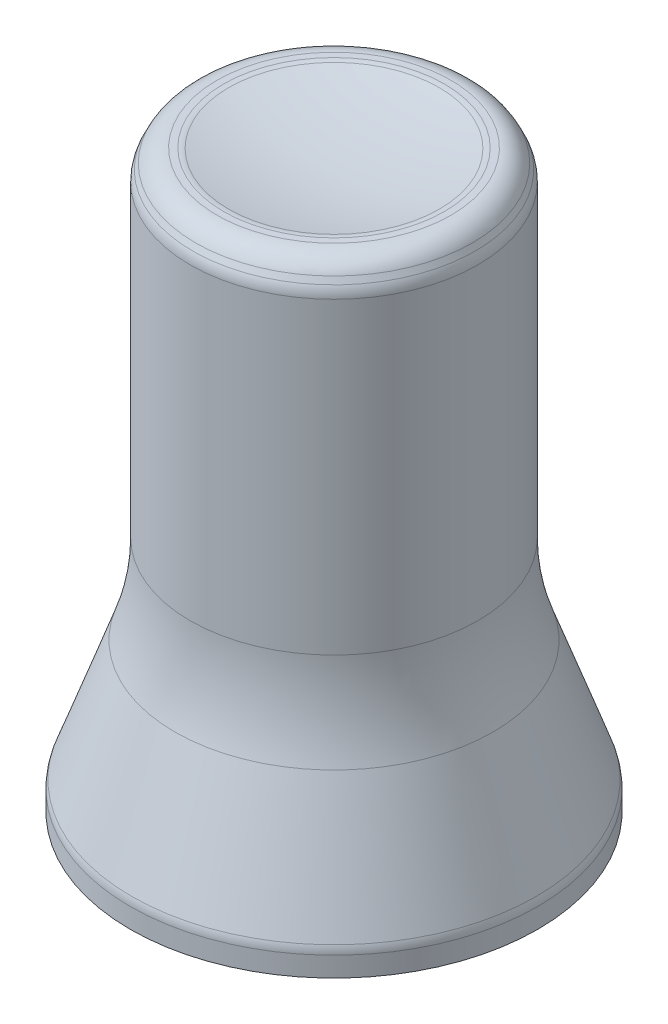
ISO-10303-21;
HEADER;
FILE_DESCRIPTION(('STEP AP214'),'2;1');
FILE_NAME('part.step','',(''),(''),'','','');
FILE_SCHEMA(('AUTOMOTIVE_DESIGN { 1 0 10303 214 1 1 1 1 }'));
ENDSEC;
DATA;
#1=APPLICATION_CONTEXT('core data for automotive mechanical design processes');
#2=APPLICATION_PROTOCOL_DEFINITION('international standard','automotive_design',2000,#1);
#3=PRODUCT_CONTEXT('',#1,'mechanical');
#4=PRODUCT('Part','Part','',(#3));
#5=PRODUCT_RELATED_PRODUCT_CATEGORY('part','',(#4));
#6=PRODUCT_DEFINITION_FORMATION('','',#4);
#7=PRODUCT_DEFINITION_CONTEXT('part definition',#1,'design');
#8=PRODUCT_DEFINITION('design','',#6,#7);
#9=PRODUCT_DEFINITION_SHAPE('','',#8);
#10=(LENGTH_UNIT() NAMED_UNIT(*) SI_UNIT(.MILLI.,.METRE.));
#11=(NAMED_UNIT(*) PLANE_ANGLE_UNIT() SI_UNIT($,.RADIAN.));
#12=(NAMED_UNIT(*) SI_UNIT($,.STERADIAN.) SOLID_ANGLE_UNIT());
#13=UNCERTAINTY_MEASURE_WITH_UNIT(LENGTH_MEASURE(1.E-05),#10,'distance_accuracy_value','');
#14=(GEOMETRIC_REPRESENTATION_CONTEXT(3) GLOBAL_UNCERTAINTY_ASSIGNED_CONTEXT((#13)) GLOBAL_UNIT_ASSIGNED_CONTEXT((#10,
#11,#12)) REPRESENTATION_CONTEXT('',''));
#15=CARTESIAN_POINT('',(0.,0.,0.));
#16=DIRECTION('',(0.,0.,1.));
#17=DIRECTION('',(1.,0.,0.));
#18=AXIS2_PLACEMENT_3D('',#15,#16,#17);
#19=CARTESIAN_POINT('',(0.,17.75,0.));
#20=DIRECTION('',(0.,1.,0.));
#21=DIRECTION('',(-1.,0.,0.));
#22=AXIS2_PLACEMENT_3D('',#19,#20,#21);
#23=CYLINDRICAL_SURFACE('',#22,3.05);
#24=CARTESIAN_POINT('',(0.,7.325,0.));
#25=DIRECTION('',(0.,1.,0.));
#26=DIRECTION('',(-1.,0.,0.));
#27=AXIS2_PLACEMENT_3D('',#24,#25,#26);
#28=CIRCLE('',#27,3.05);
#29=CARTESIAN_POINT('',(2.42487113059643,7.325,1.85));
#30=VERTEX_POINT('',#29);
#31=CARTESIAN_POINT('',(0.0999865618490292,7.325,-3.04836065573771));
#32=VERTEX_POINT('',#31);
#33=EDGE_CURVE('E105',#30,#32,#28,.T.);
#34=ORIENTED_EDGE('',*,*,#33,.F.);
#35=CARTESIAN_POINT('',(0.,9.175,0.));
#36=DIRECTION('',(0.,0.707106781186547,0.707106781186547));
#37=DIRECTION('',(0.,0.707106781186548,-0.707106781186548));
#38=AXIS2_PLACEMENT_3D('',#35,#36,#37);
#39=ELLIPSE('',#38,4.31335136523794,3.05);
#40=CARTESIAN_POINT('',(2.6556543449779,7.675,1.5));
#41=VERTEX_POINT('',#40);
#42=EDGE_CURVE('E11',#30,#41,#39,.T.);
#43=ORIENTED_EDGE('',*,*,#42,.T.);
#44=DIRECTION('',(0.,1.,0.));
#45=VECTOR('',#44,1.);
#46=CARTESIAN_POINT('',(2.6556543449779,1.79214359485084,1.5));
#47=LINE('',#46,#45);
#48=CARTESIAN_POINT('',(2.6556543449779,17.75,1.5));
#49=VERTEX_POINT('',#48);
#50=EDGE_CURVE('E79',#41,#49,#47,.T.);
#51=ORIENTED_EDGE('',*,*,#50,.T.);
#52=CARTESIAN_POINT('',(0.,17.75,0.));
#53=DIRECTION('',(0.,1.,0.));
#54=DIRECTION('',(-1.,0.,0.));
#55=AXIS2_PLACEMENT_3D('',#52,#53,#54);
#56=CIRCLE('',#55,3.05);
#57=CARTESIAN_POINT('',(0.0999865618490328,17.75,-3.04836065573771));
#58=VERTEX_POINT('',#57);
#59=EDGE_CURVE('E83',#49,#58,#56,.T.);
#60=ORIENTED_EDGE('',*,*,#59,.T.);
#61=DIRECTION('',(0.,1.,0.));
#62=VECTOR('',#61,1.);
#63=CARTESIAN_POINT('',(0.0999865618490293,1.79214359485084,-3.04836065573771));
#64=LINE('',#63,#62);
#65=EDGE_CURVE('E255',#32,#58,#64,.T.);
#66=ORIENTED_EDGE('',*,*,#65,.F.);
#67=EDGE_LOOP('',(#34,#43,#51,#60,#66));
#68=FACE_BOUND('',#67,.T.);
#69=ADVANCED_FACE('F33',(#68),#23,.F.);
#70=CARTESIAN_POINT('',(-0.0999865618490304,17.75,-3.04836065573771));
#71=VERTEX_POINT('',#70);
#72=CARTESIAN_POINT('',(-2.6556543449779,17.75,1.5));
#73=VERTEX_POINT('',#72);
#74=EDGE_CURVE('E102',#71,#73,#56,.T.);
#75=ORIENTED_EDGE('',*,*,#74,.T.);
#76=DIRECTION('',(0.,1.,0.));
#77=VECTOR('',#76,1.);
#78=CARTESIAN_POINT('',(-2.6556543449779,1.79214359485084,1.5));
#79=LINE('',#78,#77);
#80=CARTESIAN_POINT('',(-2.6556543449779,7.675,1.5));
#81=VERTEX_POINT('',#80);
#82=EDGE_CURVE('E89',#81,#73,#79,.T.);
#83=ORIENTED_EDGE('',*,*,#82,.F.);
#84=CARTESIAN_POINT('',(0.,9.175,0.));
#85=DIRECTION('',(0.,0.707106781186547,0.707106781186547));
#86=DIRECTION('',(0.,0.707106781186548,-0.707106781186548));
#87=AXIS2_PLACEMENT_3D('',#84,#85,#86);
#88=ELLIPSE('',#87,4.31335136523794,3.05);
#89=CARTESIAN_POINT('',(-2.42487113059643,7.325,1.85));
#90=VERTEX_POINT('',#89);
#91=EDGE_CURVE('E42',#81,#90,#88,.T.);
#92=ORIENTED_EDGE('',*,*,#91,.T.);
#93=CARTESIAN_POINT('',(-0.0999865618490304,7.325,-3.04836065573771));
#94=VERTEX_POINT('',#93);
#95=EDGE_CURVE('E48',#94,#90,#28,.T.);
#96=ORIENTED_EDGE('',*,*,#95,.F.);
#97=DIRECTION('',(0.,1.,0.));
#98=VECTOR('',#97,1.);
#99=CARTESIAN_POINT('',(-0.0999865618490304,1.79214359485084,-3.04836065573771));
#100=LINE('',#99,#98);
#101=EDGE_CURVE('E107',#94,#71,#100,.T.);
#102=ORIENTED_EDGE('',*,*,#101,.T.);
#103=EDGE_LOOP('',(#75,#83,#92,#96,#102));
#104=FACE_BOUND('',#103,.T.);
#105=ADVANCED_FACE('F187',(#104),#23,.F.);
#106=CARTESIAN_POINT('',(3.05,17.75,0.));
#107=DIRECTION('',(0.,-1.,0.));
#108=DIRECTION('',(1.,0.,0.));
#109=AXIS2_PLACEMENT_3D('',#106,#107,#108);
#110=PLANE('',#109);
#111=ORIENTED_EDGE('',*,*,#59,.F.);
#112=DIRECTION('',(1.,0.,0.));
#113=VECTOR('',#112,1.);
#114=CARTESIAN_POINT('',(-2.6556543449779,17.75,1.5));
#115=LINE('',#114,#113);
#116=EDGE_CURVE('E90',#73,#49,#115,.T.);
#117=ORIENTED_EDGE('',*,*,#116,.F.);
#118=ORIENTED_EDGE('',*,*,#74,.F.);
#119=CARTESIAN_POINT('',(0.,17.75,-3.05));
#120=DIRECTION('',(0.,-1.,0.));
#121=DIRECTION('',(1.,0.,0.));
#122=AXIS2_PLACEMENT_3D('',#119,#120,#121);
#123=CIRCLE('',#122,0.0999999999999998);
#124=EDGE_CURVE('E101',#58,#71,#123,.T.);
#125=ORIENTED_EDGE('',*,*,#124,.F.);
#126=EDGE_LOOP('',(#111,#117,#118,#125));
#127=FACE_BOUND('',#126,.T.);
#128=ADVANCED_FACE('F100',(#127),#110,.T.);
#129=CARTESIAN_POINT('',(0.,0.,0.));
#130=DIRECTION('',(0.,1.,0.));
#131=DIRECTION('',(-1.,0.,0.));
#132=AXIS2_PLACEMENT_3D('',#129,#130,#131);
#133=PLANE('',#132);
#134=CARTESIAN_POINT('',(0.,0.,0.));
#135=DIRECTION('',(0.,1.,0.));
#136=DIRECTION('',(-1.,0.,0.));
#137=AXIS2_PLACEMENT_3D('',#134,#135,#136);
#138=CIRCLE('',#137,3.875);
#139=CARTESIAN_POINT('',(-3.875,0.,0.));
#140=VERTEX_POINT('',#139);
#141=EDGE_CURVE('E117',#140,#140,#138,.T.);
#142=ORIENTED_EDGE('',*,*,#141,.T.);
#143=EDGE_LOOP('',(#142));
#144=FACE_BOUND('',#143,.T.);
#145=CARTESIAN_POINT('',(0.,0.,0.));
#146=DIRECTION('',(0.,1.,0.));
#147=DIRECTION('',(-1.,0.,0.));
#148=AXIS2_PLACEMENT_3D('',#145,#146,#147);
#149=CIRCLE('',#148,8.5);
#150=CARTESIAN_POINT('',(-8.5,0.,0.));
#151=VERTEX_POINT('',#150);
#152=EDGE_CURVE('E120',#151,#151,#149,.T.);
#153=ORIENTED_EDGE('',*,*,#152,.F.);
#154=EDGE_LOOP('',(#153));
#155=FACE_BOUND('',#154,.T.);
#156=ADVANCED_FACE('F157',(#144,#155),#133,.F.);
#157=CARTESIAN_POINT('',(0.,23.5,0.));
#158=DIRECTION('',(0.,1.,0.));
#159=DIRECTION('',(-1.,0.,0.));
#160=AXIS2_PLACEMENT_3D('',#157,#158,#159);
#161=CYLINDRICAL_SURFACE('',#160,8.5);
#162=CARTESIAN_POINT('',(0.,0.8267862505363,0.));
#163=DIRECTION('',(0.,-1.,0.));
#164=DIRECTION('',(1.,0.,0.));
#165=AXIS2_PLACEMENT_3D('',#162,#163,#164);
#166=CIRCLE('',#165,8.5);
#167=CARTESIAN_POINT('',(8.5,0.8267862505363,0.));
#168=VERTEX_POINT('',#167);
#169=EDGE_CURVE('E222',#168,#168,#166,.T.);
#170=ORIENTED_EDGE('',*,*,#169,.T.);
#171=EDGE_LOOP('',(#170));
#172=FACE_BOUND('',#171,.T.);
#173=ORIENTED_EDGE('',*,*,#152,.T.);
#174=EDGE_LOOP('',(#173));
#175=FACE_BOUND('',#174,.T.);
#176=ADVANCED_FACE('F153',(#172,#175),#161,.T.);
#177=CARTESIAN_POINT('',(0.,1.,0.));
#178=DIRECTION('',(0.,-1.,0.));
#179=DIRECTION('',(1.,0.,0.));
#180=AXIS2_PLACEMENT_3D('',#177,#178,#179);
#181=CONICAL_SURFACE('',#180,8.5,0.343023940420703);
#182=CARTESIAN_POINT('',(0.,1.16312264753446,0.));
#183=DIRECTION('',(0.,1.,0.));
#184=DIRECTION('',(-1.,0.,0.));
#185=AXIS2_PLACEMENT_3D('',#182,#183,#184);
#186=CIRCLE('',#185,8.44174191159484);
#187=CARTESIAN_POINT('',(-8.44174191159484,1.16312264753446,0.));
#188=VERTEX_POINT('',#187);
#189=EDGE_CURVE('E217',#188,#188,#186,.T.);
#190=ORIENTED_EDGE('',*,*,#189,.T.);
#191=EDGE_LOOP('',(#190));
#192=FACE_BOUND('',#191,.T.);
#193=CARTESIAN_POINT('',(0.,6.205650877121,0.));
#194=DIRECTION('',(0.,-1.,0.));
#195=DIRECTION('',(1.,0.,0.));
#196=AXIS2_PLACEMENT_3D('',#193,#194,#195);
#197=CIRCLE('',#196,6.64083897245679);
#198=CARTESIAN_POINT('',(6.64083897245679,6.205650877121,0.));
#199=VERTEX_POINT('',#198);
#200=EDGE_CURVE('E213',#199,#199,#197,.T.);
#201=ORIENTED_EDGE('',*,*,#200,.T.);
#202=EDGE_LOOP('',(#201));
#203=FACE_BOUND('',#202,.T.);
#204=ADVANCED_FACE('F149',(#192,#203),#181,.T.);
#205=CARTESIAN_POINT('',(0.,23.5,0.));
#206=DIRECTION('',(0.,1.,0.));
#207=DIRECTION('',(-1.,0.,0.));
#208=AXIS2_PLACEMENT_3D('',#205,#206,#207);
#209=CYLINDRICAL_SURFACE('',#208,6.);
#210=CARTESIAN_POINT('',(0.,22.7639320225002,0.));
#211=DIRECTION('',(0.,-1.,0.));
#212=DIRECTION('',(1.,0.,0.));
#213=AXIS2_PLACEMENT_3D('',#210,#211,#212);
#214=CIRCLE('',#213,6.);
#215=CARTESIAN_POINT('',(6.,22.7639320225002,0.));
#216=VERTEX_POINT('',#215);
#217=EDGE_CURVE('E240',#216,#216,#214,.T.);
#218=ORIENTED_EDGE('',*,*,#217,.T.);
#219=EDGE_LOOP('',(#218));
#220=FACE_BOUND('',#219,.T.);
#221=CARTESIAN_POINT('',(0.,9.90535124410072,0.));
#222=DIRECTION('',(0.,1.,0.));
#223=DIRECTION('',(-1.,0.,0.));
#224=AXIS2_PLACEMENT_3D('',#221,#222,#223);
#225=CIRCLE('',#224,6.);
#226=CARTESIAN_POINT('',(-6.,9.90535124410072,0.));
#227=VERTEX_POINT('',#226);
#228=EDGE_CURVE('E211',#227,#227,#225,.T.);
#229=ORIENTED_EDGE('',*,*,#228,.T.);
#230=EDGE_LOOP('',(#229));
#231=FACE_BOUND('',#230,.T.);
#232=ADVANCED_FACE('F145',(#220,#231),#209,.T.);
#233=CARTESIAN_POINT('',(0.,23.,0.));
#234=DIRECTION('',(0.,-1.,0.));
#235=DIRECTION('',(1.,0.,0.));
#236=AXIS2_PLACEMENT_3D('',#233,#234,#235);
#237=CONICAL_SURFACE('',#236,6.,0.463647609000806);
#238=CARTESIAN_POINT('',(0.,23.4472135955,0.));
#239=DIRECTION('',(0.,1.,0.));
#240=DIRECTION('',(-1.,0.,0.));
#241=AXIS2_PLACEMENT_3D('',#238,#239,#240);
#242=CIRCLE('',#241,5.77639320225002);
#243=CARTESIAN_POINT('',(-5.77639320225002,23.4472135955,0.));
#244=VERTEX_POINT('',#243);
#245=EDGE_CURVE('E237',#244,#244,#242,.F.);
#246=ORIENTED_EDGE('',*,*,#245,.T.);
#247=EDGE_LOOP('',(#246));
#248=FACE_BOUND('',#247,.T.);
#249=CARTESIAN_POINT('',(0.,23.2111456180002,0.));
#250=DIRECTION('',(0.,1.,0.));
#251=DIRECTION('',(-1.,0.,0.));
#252=AXIS2_PLACEMENT_3D('',#249,#250,#251);
#253=CIRCLE('',#252,5.89442719099992);
#254=CARTESIAN_POINT('',(-5.89442719099992,23.2111456180002,0.));
#255=VERTEX_POINT('',#254);
#256=EDGE_CURVE('E234',#255,#255,#253,.T.);
#257=ORIENTED_EDGE('',*,*,#256,.T.);
#258=EDGE_LOOP('',(#257));
#259=FACE_BOUND('',#258,.T.);
#260=ADVANCED_FACE('F141',(#248,#259),#237,.T.);
#261=CARTESIAN_POINT('',(5.5,24.,0.));
#262=DIRECTION('',(0.,-1.,0.));
#263=DIRECTION('',(1.,0.,0.));
#264=AXIS2_PLACEMENT_3D('',#261,#262,#263);
#265=PLANE('',#264);
#266=CARTESIAN_POINT('',(0.,24.,0.));
#267=DIRECTION('',(0.,-1.,0.));
#268=DIRECTION('',(1.,0.,0.));
#269=AXIS2_PLACEMENT_3D('',#266,#267,#268);
#270=CIRCLE('',#269,4.60978743873983);
#271=CARTESIAN_POINT('',(4.60978743873983,24.,0.));
#272=VERTEX_POINT('',#271);
#273=EDGE_CURVE('E231',#272,#272,#270,.T.);
#274=ORIENTED_EDGE('',*,*,#273,.T.);
#275=EDGE_LOOP('',(#274));
#276=FACE_BOUND('',#275,.T.);
#277=CARTESIAN_POINT('',(0.,24.,0.));
#278=DIRECTION('',(0.,-1.,0.));
#279=DIRECTION('',(1.,0.,0.));
#280=AXIS2_PLACEMENT_3D('',#277,#278,#279);
#281=CIRCLE('',#280,4.88196601125011);
#282=CARTESIAN_POINT('',(4.88196601125011,24.,0.));
#283=VERTEX_POINT('',#282);
#284=EDGE_CURVE('E228',#283,#283,#281,.F.);
#285=ORIENTED_EDGE('',*,*,#284,.T.);
#286=EDGE_LOOP('',(#285));
#287=FACE_BOUND('',#286,.T.);
#288=ADVANCED_FACE('F135',(#276,#287),#265,.F.);
#289=CARTESIAN_POINT('',(4.5,24.,0.));
#290=CARTESIAN_POINT('',(2.27777777777778,23.5,0.));
#291=CARTESIAN_POINT('',(0.,23.5,0.));
#292=B_SPLINE_CURVE_WITH_KNOTS('',2,(#289,#290,#291),.UNSPECIFIED.,.F.,.F.,(3,3),(0.,1.),.UNSPECIFIED.);
#293=CARTESIAN_POINT('',(0.,23.5,0.));
#294=DIRECTION('',(0.,1.,0.));
#295=AXIS1_PLACEMENT('',#293,#294);
#296=SURFACE_OF_REVOLUTION('',#292,#295);
#297=CARTESIAN_POINT('',(0.,23.9767318917327,0.));
#298=DIRECTION('',(0.,1.,0.));
#299=DIRECTION('',(-1.,0.,0.));
#300=AXIS2_PLACEMENT_3D('',#297,#298,#299);
#301=CIRCLE('',#300,4.39532342853712);
#302=CARTESIAN_POINT('',(-4.39532342853712,23.9767318917327,0.));
#303=VERTEX_POINT('',#302);
#304=EDGE_CURVE('E225',#303,#303,#301,.T.);
#305=ORIENTED_EDGE('',*,*,#304,.T.);
#306=EDGE_LOOP('',(#305));
#307=FACE_BOUND('',#306,.T.);
#308=CARTESIAN_POINT('',(0.,23.5,0.));
#309=VERTEX_POINT('',#308);
#310=VERTEX_LOOP('',#309);
#311=FACE_BOUND('',#310,.T.);
#312=ADVANCED_FACE('F130',(#307,#311),#296,.T.);
#313=CARTESIAN_POINT('',(0.,9.90535124410072,0.));
#314=DIRECTION('',(0.,1.,0.));
#315=DIRECTION('',(-1.,0.,0.));
#316=AXIS2_PLACEMENT_3D('',#313,#314,#315);
#317=TOROIDAL_SURFACE('',#316,17.,11.);
#318=ORIENTED_EDGE('',*,*,#200,.F.);
#319=EDGE_LOOP('',(#318));
#320=FACE_BOUND('',#319,.T.);
#321=ORIENTED_EDGE('',*,*,#228,.F.);
#322=EDGE_LOOP('',(#321));
#323=FACE_BOUND('',#322,.T.);
#324=ADVANCED_FACE('F134',(#320,#323),#317,.F.);
#325=CARTESIAN_POINT('',(0.,0.8267862505363,0.));
#326=DIRECTION('',(0.,-1.,0.));
#327=DIRECTION('',(1.,0.,0.));
#328=AXIS2_PLACEMENT_3D('',#325,#326,#327);
#329=TOROIDAL_SURFACE('',#328,7.5,1.);
#330=ORIENTED_EDGE('',*,*,#169,.F.);
#331=EDGE_LOOP('',(#330));
#332=FACE_BOUND('',#331,.T.);
#333=ORIENTED_EDGE('',*,*,#189,.F.);
#334=EDGE_LOOP('',(#333));
#335=FACE_BOUND('',#334,.T.);
#336=ADVANCED_FACE('F164',(#332,#335),#329,.T.);
#337=CARTESIAN_POINT('',(0.,23.,0.));
#338=DIRECTION('',(0.,1.,0.));
#339=DIRECTION('',(-1.,0.,0.));
#340=AXIS2_PLACEMENT_3D('',#337,#338,#339);
#341=TOROIDAL_SURFACE('',#340,4.60978743873983,1.);
#342=ORIENTED_EDGE('',*,*,#273,.F.);
#343=EDGE_LOOP('',(#342));
#344=FACE_BOUND('',#343,.T.);
#345=ORIENTED_EDGE('',*,*,#304,.F.);
#346=EDGE_LOOP('',(#345));
#347=FACE_BOUND('',#346,.T.);
#348=ADVANCED_FACE('F168',(#344,#347),#341,.T.);
#349=CARTESIAN_POINT('',(0.,23.,0.));
#350=DIRECTION('',(0.,-1.,0.));
#351=DIRECTION('',(1.,0.,0.));
#352=AXIS2_PLACEMENT_3D('',#349,#350,#351);
#353=TOROIDAL_SURFACE('',#352,4.88196601125011,1.);
#354=ORIENTED_EDGE('',*,*,#245,.F.);
#355=EDGE_LOOP('',(#354));
#356=FACE_BOUND('',#355,.T.);
#357=ORIENTED_EDGE('',*,*,#284,.F.);
#358=EDGE_LOOP('',(#357));
#359=FACE_BOUND('',#358,.T.);
#360=ADVANCED_FACE('F172',(#356,#359),#353,.T.);
#361=CARTESIAN_POINT('',(0.,22.7639320225002,0.));
#362=DIRECTION('',(0.,-1.,0.));
#363=DIRECTION('',(1.,0.,0.));
#364=AXIS2_PLACEMENT_3D('',#361,#362,#363);
#365=TOROIDAL_SURFACE('',#364,5.,1.);
#366=ORIENTED_EDGE('',*,*,#217,.F.);
#367=EDGE_LOOP('',(#366));
#368=FACE_BOUND('',#367,.T.);
#369=ORIENTED_EDGE('',*,*,#256,.F.);
#370=EDGE_LOOP('',(#369));
#371=FACE_BOUND('',#370,.T.);
#372=ADVANCED_FACE('F175',(#368,#371),#365,.T.);
#373=CARTESIAN_POINT('',(0.,17.75,0.));
#374=DIRECTION('',(0.,1.,0.));
#375=DIRECTION('',(-1.,0.,0.));
#376=AXIS2_PLACEMENT_3D('',#373,#374,#375);
#377=CYLINDRICAL_SURFACE('',#376,3.875);
#378=CARTESIAN_POINT('',(0.,6.5,0.));
#379=DIRECTION('',(0.,1.,0.));
#380=DIRECTION('',(-1.,0.,0.));
#381=AXIS2_PLACEMENT_3D('',#378,#379,#380);
#382=CIRCLE('',#381,3.875);
#383=CARTESIAN_POINT('',(-3.875,6.5,0.));
#384=VERTEX_POINT('',#383);
#385=EDGE_CURVE('E114',#384,#384,#382,.T.);
#386=ORIENTED_EDGE('',*,*,#385,.T.);
#387=EDGE_LOOP('',(#386));
#388=FACE_BOUND('',#387,.T.);
#389=ORIENTED_EDGE('',*,*,#141,.F.);
#390=EDGE_LOOP('',(#389));
#391=FACE_BOUND('',#390,.T.);
#392=ADVANCED_FACE('F137',(#388,#391),#377,.F.);
#393=CARTESIAN_POINT('',(0.,6.5,0.));
#394=DIRECTION('',(0.,-1.,0.));
#395=DIRECTION('',(1.,0.,0.));
#396=AXIS2_PLACEMENT_3D('',#393,#394,#395);
#397=CONICAL_SURFACE('',#396,3.875,0.785398163397448);
#398=EDGE_CURVE('E112',#32,#94,#28,.T.);
#399=ORIENTED_EDGE('',*,*,#398,.T.);
#400=ORIENTED_EDGE('',*,*,#95,.T.);
#401=CARTESIAN_POINT('',(0.,7.325,0.));
#402=DIRECTION('',(0.,1.,0.));
#403=DIRECTION('',(0.,0.,1.));
#404=AXIS2_PLACEMENT_3D('',#401,#402,#403);
#405=CIRCLE('',#404,3.05);
#406=EDGE_CURVE('E253',#90,#30,#405,.T.);
#407=ORIENTED_EDGE('',*,*,#406,.T.);
#408=ORIENTED_EDGE('',*,*,#33,.T.);
#409=EDGE_LOOP('',(#399,#400,#407,#408));
#410=FACE_BOUND('',#409,.T.);
#411=ORIENTED_EDGE('',*,*,#385,.F.);
#412=EDGE_LOOP('',(#411));
#413=FACE_BOUND('',#412,.T.);
#414=ADVANCED_FACE('F182',(#410,#413),#397,.F.);
#415=CARTESIAN_POINT('',(0.,1.79214359485084,-3.05));
#416=DIRECTION('',(0.,1.,0.));
#417=DIRECTION('',(-1.,0.,0.));
#418=AXIS2_PLACEMENT_3D('',#415,#416,#417);
#419=CYLINDRICAL_SURFACE('',#418,0.0999999999999998);
#420=ORIENTED_EDGE('',*,*,#101,.F.);
#421=CARTESIAN_POINT('',(0.,7.325,-3.05));
#422=DIRECTION('',(0.,1.,0.));
#423=DIRECTION('',(0.,0.,1.));
#424=AXIS2_PLACEMENT_3D('',#421,#422,#423);
#425=CIRCLE('',#424,0.0999999999999998);
#426=EDGE_CURVE('E103',#94,#32,#425,.T.);
#427=ORIENTED_EDGE('',*,*,#426,.T.);
#428=ORIENTED_EDGE('',*,*,#65,.T.);
#429=ORIENTED_EDGE('',*,*,#124,.T.);
#430=EDGE_LOOP('',(#420,#427,#428,#429));
#431=FACE_BOUND('',#430,.T.);
#432=ADVANCED_FACE('F196',(#431),#419,.T.);
#433=CARTESIAN_POINT('',(0.,7.325,0.));
#434=DIRECTION('',(0.,1.,0.));
#435=DIRECTION('',(0.,0.,1.));
#436=AXIS2_PLACEMENT_3D('',#433,#434,#435);
#437=PLANE('',#436);
#438=ORIENTED_EDGE('',*,*,#398,.F.);
#439=ORIENTED_EDGE('',*,*,#426,.F.);
#440=EDGE_LOOP('',(#438,#439));
#441=FACE_BOUND('',#440,.T.);
#442=ADVANCED_FACE('F200',(#441),#437,.F.);
#443=CARTESIAN_POINT('',(-2.6556543449779,1.79214359485084,1.5));
#444=DIRECTION('',(0.,0.,1.));
#445=DIRECTION('',(1.,0.,0.));
#446=AXIS2_PLACEMENT_3D('',#443,#444,#445);
#447=PLANE('',#446);
#448=ORIENTED_EDGE('',*,*,#50,.F.);
#449=DIRECTION('',(-1.,0.,0.));
#450=VECTOR('',#449,1.);
#451=CARTESIAN_POINT('',(-2.6556543449779,7.675,1.5));
#452=LINE('',#451,#450);
#453=EDGE_CURVE('E243',#41,#81,#452,.T.);
#454=ORIENTED_EDGE('',*,*,#453,.T.);
#455=ORIENTED_EDGE('',*,*,#82,.T.);
#456=ORIENTED_EDGE('',*,*,#116,.T.);
#457=EDGE_LOOP('',(#448,#454,#455,#456));
#458=FACE_BOUND('',#457,.T.);
#459=ADVANCED_FACE('F93',(#458),#447,.F.);
#460=CARTESIAN_POINT('',(0.,7.325,0.));
#461=DIRECTION('',(0.,1.,0.));
#462=DIRECTION('',(0.,0.,1.));
#463=AXIS2_PLACEMENT_3D('',#460,#461,#462);
#464=PLANE('',#463);
#465=ORIENTED_EDGE('',*,*,#406,.F.);
#466=DIRECTION('',(1.,0.,0.));
#467=VECTOR('',#466,1.);
#468=CARTESIAN_POINT('',(0.,7.325,1.85));
#469=LINE('',#468,#467);
#470=EDGE_CURVE('E245',#90,#30,#469,.T.);
#471=ORIENTED_EDGE('',*,*,#470,.T.);
#472=EDGE_LOOP('',(#465,#471));
#473=FACE_BOUND('',#472,.T.);
#474=ADVANCED_FACE('F252',(#473),#464,.F.);
#475=CARTESIAN_POINT('',(-2.6556543449779,7.675,1.5));
#476=DIRECTION('',(0.,0.707106781186547,0.707106781186547));
#477=DIRECTION('',(-1.,0.,0.));
#478=AXIS2_PLACEMENT_3D('',#475,#476,#477);
#479=PLANE('',#478);
#480=ORIENTED_EDGE('',*,*,#42,.F.);
#481=ORIENTED_EDGE('',*,*,#470,.F.);
#482=ORIENTED_EDGE('',*,*,#91,.F.);
#483=ORIENTED_EDGE('',*,*,#453,.F.);
#484=EDGE_LOOP('',(#480,#481,#482,#483));
#485=FACE_BOUND('',#484,.T.);
#486=ADVANCED_FACE('F35',(#485),#479,.F.);
#487=CLOSED_SHELL('',(#69,#105,#128,#156,#176,#204,#232,#260,#288,#312,#324,#336,#348,#360,#372,
#392,#414,#432,#442,#459,#474,#486));
#488=MANIFOLD_SOLID_BREP('B2',#487);
#489=ADVANCED_BREP_SHAPE_REPRESENTATION('',(#18,#488),#14);
#490=SHAPE_DEFINITION_REPRESENTATION(#9,#489);
ENDSEC;
END-ISO-10303-21;
